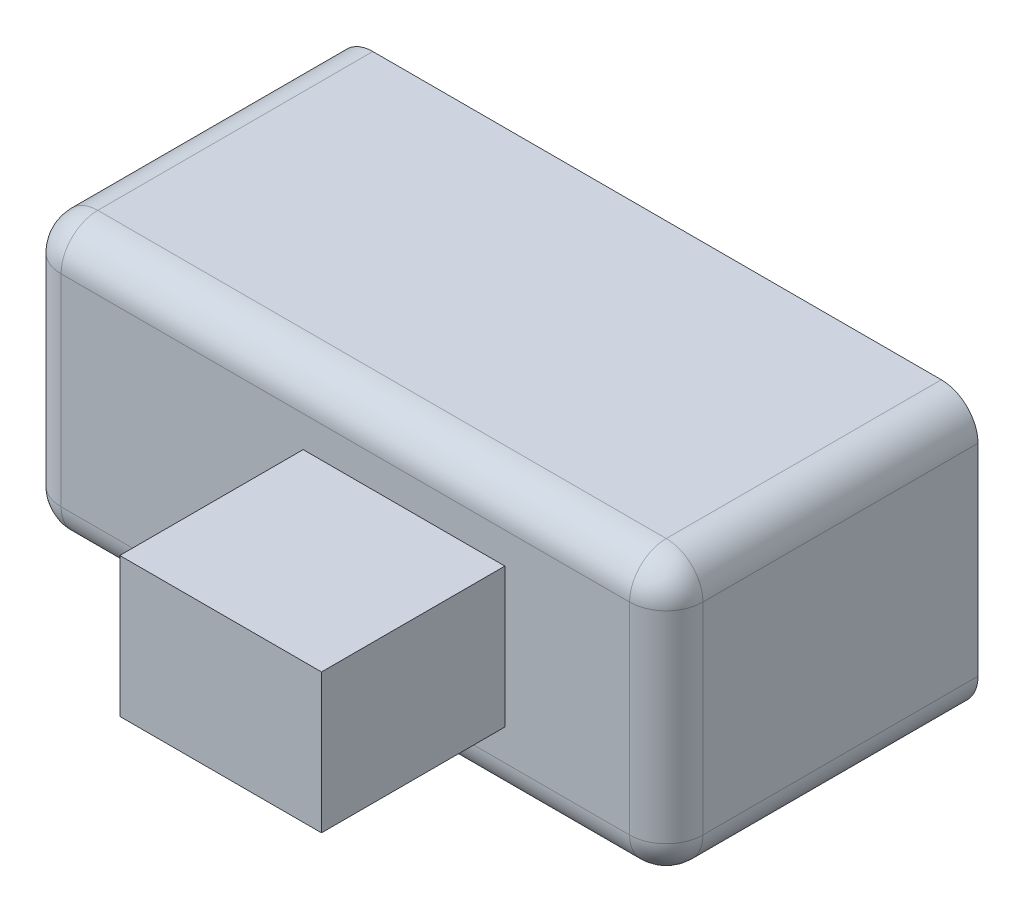
ISO-10303-21;
HEADER;
FILE_DESCRIPTION(('STEP AP214'),'2;1');
FILE_NAME('part.step','',(''),(''),'','','');
FILE_SCHEMA(('AUTOMOTIVE_DESIGN { 1 0 10303 214 1 1 1 1 }'));
ENDSEC;
DATA;
#1=APPLICATION_CONTEXT('core data for automotive mechanical design processes');
#2=APPLICATION_PROTOCOL_DEFINITION('international standard','automotive_design',2000,#1);
#3=PRODUCT_CONTEXT('',#1,'mechanical');
#4=PRODUCT('Part','Part','',(#3));
#5=PRODUCT_RELATED_PRODUCT_CATEGORY('part','',(#4));
#6=PRODUCT_DEFINITION_FORMATION('','',#4);
#7=PRODUCT_DEFINITION_CONTEXT('part definition',#1,'design');
#8=PRODUCT_DEFINITION('design','',#6,#7);
#9=PRODUCT_DEFINITION_SHAPE('','',#8);
#10=(LENGTH_UNIT() NAMED_UNIT(*) SI_UNIT(.MILLI.,.METRE.));
#11=(NAMED_UNIT(*) PLANE_ANGLE_UNIT() SI_UNIT($,.RADIAN.));
#12=(NAMED_UNIT(*) SI_UNIT($,.STERADIAN.) SOLID_ANGLE_UNIT());
#13=UNCERTAINTY_MEASURE_WITH_UNIT(LENGTH_MEASURE(1.E-05),#10,'distance_accuracy_value','');
#14=(GEOMETRIC_REPRESENTATION_CONTEXT(3) GLOBAL_UNCERTAINTY_ASSIGNED_CONTEXT((#13)) GLOBAL_UNIT_ASSIGNED_CONTEXT((#10,
#11,#12)) REPRESENTATION_CONTEXT('',''));
#15=CARTESIAN_POINT('',(0.,0.,0.));
#16=DIRECTION('',(0.,0.,1.));
#17=DIRECTION('',(1.,0.,0.));
#18=AXIS2_PLACEMENT_3D('',#15,#16,#17);
#19=CARTESIAN_POINT('',(0.,0.,8.5));
#20=DIRECTION('',(0.,0.,1.));
#21=DIRECTION('',(1.,0.,0.));
#22=AXIS2_PLACEMENT_3D('',#19,#20,#21);
#23=PLANE('',#22);
#24=DIRECTION('',(0.,-1.,0.));
#25=VECTOR('',#24,1.);
#26=CARTESIAN_POINT('',(-7.75,-2.75,8.5));
#27=LINE('',#26,#25);
#28=CARTESIAN_POINT('',(-7.75,2.75,8.5));
#29=VERTEX_POINT('',#28);
#30=CARTESIAN_POINT('',(-7.75,-2.75,8.5));
#31=VERTEX_POINT('',#30);
#32=EDGE_CURVE('E229',#29,#31,#27,.T.);
#33=ORIENTED_EDGE('',*,*,#32,.T.);
#34=DIRECTION('',(1.,0.,0.));
#35=VECTOR('',#34,1.);
#36=CARTESIAN_POINT('',(7.75,-2.75,8.5));
#37=LINE('',#36,#35);
#38=CARTESIAN_POINT('',(7.75,-2.75,8.5));
#39=VERTEX_POINT('',#38);
#40=EDGE_CURVE('E231',#31,#39,#37,.T.);
#41=ORIENTED_EDGE('',*,*,#40,.T.);
#42=DIRECTION('',(0.,1.,0.));
#43=VECTOR('',#42,1.);
#44=CARTESIAN_POINT('',(7.75,2.75,8.5));
#45=LINE('',#44,#43);
#46=CARTESIAN_POINT('',(7.75,2.75,8.5));
#47=VERTEX_POINT('',#46);
#48=EDGE_CURVE('E225',#39,#47,#45,.T.);
#49=ORIENTED_EDGE('',*,*,#48,.T.);
#50=DIRECTION('',(-1.,0.,0.));
#51=VECTOR('',#50,1.);
#52=CARTESIAN_POINT('',(-7.75,2.75,8.5));
#53=LINE('',#52,#51);
#54=EDGE_CURVE('E227',#47,#29,#53,.T.);
#55=ORIENTED_EDGE('',*,*,#54,.T.);
#56=EDGE_LOOP('',(#33,#41,#49,#55));
#57=FACE_BOUND('',#56,.T.);
#58=DIRECTION('',(-1.,0.,0.));
#59=VECTOR('',#58,1.);
#60=CARTESIAN_POINT('',(-1.15,1.9,8.5));
#61=LINE('',#60,#59);
#62=CARTESIAN_POINT('',(4.35,1.9,8.5));
#63=VERTEX_POINT('',#62);
#64=CARTESIAN_POINT('',(-1.15,1.9,8.5));
#65=VERTEX_POINT('',#64);
#66=EDGE_CURVE('E269',#63,#65,#61,.T.);
#67=ORIENTED_EDGE('',*,*,#66,.F.);
#68=DIRECTION('',(0.,1.,0.));
#69=VECTOR('',#68,1.);
#70=CARTESIAN_POINT('',(4.35,1.9,8.5));
#71=LINE('',#70,#69);
#72=CARTESIAN_POINT('',(4.35,-1.9,8.5));
#73=VERTEX_POINT('',#72);
#74=EDGE_CURVE('E177',#73,#63,#71,.T.);
#75=ORIENTED_EDGE('',*,*,#74,.F.);
#76=DIRECTION('',(1.,0.,0.));
#77=VECTOR('',#76,1.);
#78=CARTESIAN_POINT('',(-1.15,-1.9,8.5));
#79=LINE('',#78,#77);
#80=CARTESIAN_POINT('',(-1.15,-1.9,8.5));
#81=VERTEX_POINT('',#80);
#82=EDGE_CURVE('E173',#81,#73,#79,.T.);
#83=ORIENTED_EDGE('',*,*,#82,.F.);
#84=DIRECTION('',(0.,-1.,0.));
#85=VECTOR('',#84,1.);
#86=CARTESIAN_POINT('',(-1.15,1.9,8.5));
#87=LINE('',#86,#85);
#88=EDGE_CURVE('E271',#65,#81,#87,.T.);
#89=ORIENTED_EDGE('',*,*,#88,.F.);
#90=EDGE_LOOP('',(#67,#75,#83,#89));
#91=FACE_BOUND('',#90,.T.);
#92=ADVANCED_FACE('F51',(#57,#91),#23,.T.);
#93=CARTESIAN_POINT('',(8.75,3.75,8.5));
#94=DIRECTION('',(-1.,0.,0.));
#95=DIRECTION('',(0.,0.,1.));
#96=AXIS2_PLACEMENT_3D('',#93,#94,#95);
#97=PLANE('',#96);
#98=DIRECTION('',(0.,0.,-1.));
#99=VECTOR('',#98,1.);
#100=CARTESIAN_POINT('',(8.75,2.75,8.5));
#101=LINE('',#100,#99);
#102=CARTESIAN_POINT('',(8.75,2.75,0.));
#103=VERTEX_POINT('',#102);
#104=CARTESIAN_POINT('',(8.75,2.75,7.5));
#105=VERTEX_POINT('',#104);
#106=EDGE_CURVE('E196',#103,#105,#101,.F.);
#107=ORIENTED_EDGE('',*,*,#106,.T.);
#108=DIRECTION('',(0.,1.,0.));
#109=VECTOR('',#108,1.);
#110=CARTESIAN_POINT('',(8.75,-2.75,7.5));
#111=LINE('',#110,#109);
#112=CARTESIAN_POINT('',(8.75,-2.75,7.5));
#113=VERTEX_POINT('',#112);
#114=EDGE_CURVE('E12',#105,#113,#111,.F.);
#115=ORIENTED_EDGE('',*,*,#114,.T.);
#116=DIRECTION('',(0.,0.,-1.));
#117=VECTOR('',#116,1.);
#118=CARTESIAN_POINT('',(8.75,-2.75,8.5));
#119=LINE('',#118,#117);
#120=CARTESIAN_POINT('',(8.75,-2.75,0.));
#121=VERTEX_POINT('',#120);
#122=EDGE_CURVE('E198',#113,#121,#119,.T.);
#123=ORIENTED_EDGE('',*,*,#122,.T.);
#124=DIRECTION('',(0.,1.,0.));
#125=VECTOR('',#124,1.);
#126=CARTESIAN_POINT('',(8.75,3.75,0.));
#127=LINE('',#126,#125);
#128=EDGE_CURVE('E179',#121,#103,#127,.T.);
#129=ORIENTED_EDGE('',*,*,#128,.T.);
#130=EDGE_LOOP('',(#107,#115,#123,#129));
#131=FACE_BOUND('',#130,.T.);
#132=ADVANCED_FACE('F289',(#131),#97,.F.);
#133=CARTESIAN_POINT('',(-8.75,3.75,8.5));
#134=DIRECTION('',(0.,-1.,0.));
#135=DIRECTION('',(0.,0.,-1.));
#136=AXIS2_PLACEMENT_3D('',#133,#134,#135);
#137=PLANE('',#136);
#138=DIRECTION('',(0.,0.,-1.));
#139=VECTOR('',#138,1.);
#140=CARTESIAN_POINT('',(-7.75,3.75,8.5));
#141=LINE('',#140,#139);
#142=CARTESIAN_POINT('',(-7.75,3.75,0.));
#143=VERTEX_POINT('',#142);
#144=CARTESIAN_POINT('',(-7.75,3.75,7.5));
#145=VERTEX_POINT('',#144);
#146=EDGE_CURVE('E213',#143,#145,#141,.F.);
#147=ORIENTED_EDGE('',*,*,#146,.T.);
#148=DIRECTION('',(-1.,0.,0.));
#149=VECTOR('',#148,1.);
#150=CARTESIAN_POINT('',(7.75,3.75,7.5));
#151=LINE('',#150,#149);
#152=CARTESIAN_POINT('',(7.75,3.75,7.5));
#153=VERTEX_POINT('',#152);
#154=EDGE_CURVE('E75',#145,#153,#151,.F.);
#155=ORIENTED_EDGE('',*,*,#154,.T.);
#156=DIRECTION('',(0.,0.,-1.));
#157=VECTOR('',#156,1.);
#158=CARTESIAN_POINT('',(7.75,3.75,8.5));
#159=LINE('',#158,#157);
#160=CARTESIAN_POINT('',(7.75,3.75,0.));
#161=VERTEX_POINT('',#160);
#162=EDGE_CURVE('E215',#153,#161,#159,.T.);
#163=ORIENTED_EDGE('',*,*,#162,.T.);
#164=DIRECTION('',(-1.,0.,0.));
#165=VECTOR('',#164,1.);
#166=CARTESIAN_POINT('',(-8.75,3.75,0.));
#167=LINE('',#166,#165);
#168=EDGE_CURVE('E182',#161,#143,#167,.T.);
#169=ORIENTED_EDGE('',*,*,#168,.T.);
#170=EDGE_LOOP('',(#147,#155,#163,#169));
#171=FACE_BOUND('',#170,.T.);
#172=ADVANCED_FACE('F295',(#171),#137,.F.);
#173=CARTESIAN_POINT('',(-8.75,3.75,8.5));
#174=DIRECTION('',(1.,0.,0.));
#175=DIRECTION('',(0.,0.,-1.));
#176=AXIS2_PLACEMENT_3D('',#173,#174,#175);
#177=PLANE('',#176);
#178=DIRECTION('',(0.,0.,-1.));
#179=VECTOR('',#178,1.);
#180=CARTESIAN_POINT('',(-8.75,-2.75,8.5));
#181=LINE('',#180,#179);
#182=CARTESIAN_POINT('',(-8.75,-2.75,0.));
#183=VERTEX_POINT('',#182);
#184=CARTESIAN_POINT('',(-8.75,-2.75,7.5));
#185=VERTEX_POINT('',#184);
#186=EDGE_CURVE('E219',#183,#185,#181,.F.);
#187=ORIENTED_EDGE('',*,*,#186,.T.);
#188=DIRECTION('',(0.,-1.,0.));
#189=VECTOR('',#188,1.);
#190=CARTESIAN_POINT('',(-8.75,2.75,7.5));
#191=LINE('',#190,#189);
#192=CARTESIAN_POINT('',(-8.75,2.75,7.5));
#193=VERTEX_POINT('',#192);
#194=EDGE_CURVE('E238',#185,#193,#191,.F.);
#195=ORIENTED_EDGE('',*,*,#194,.T.);
#196=DIRECTION('',(0.,0.,-1.));
#197=VECTOR('',#196,1.);
#198=CARTESIAN_POINT('',(-8.75,2.75,8.5));
#199=LINE('',#198,#197);
#200=CARTESIAN_POINT('',(-8.75,2.75,0.));
#201=VERTEX_POINT('',#200);
#202=EDGE_CURVE('E217',#193,#201,#199,.T.);
#203=ORIENTED_EDGE('',*,*,#202,.T.);
#204=DIRECTION('',(0.,-1.,0.));
#205=VECTOR('',#204,1.);
#206=CARTESIAN_POINT('',(-8.75,3.75,0.));
#207=LINE('',#206,#205);
#208=EDGE_CURVE('E190',#201,#183,#207,.T.);
#209=ORIENTED_EDGE('',*,*,#208,.T.);
#210=EDGE_LOOP('',(#187,#195,#203,#209));
#211=FACE_BOUND('',#210,.T.);
#212=ADVANCED_FACE('F308',(#211),#177,.F.);
#213=CARTESIAN_POINT('',(-8.75,-3.75,8.5));
#214=DIRECTION('',(0.,1.,0.));
#215=DIRECTION('',(0.,0.,1.));
#216=AXIS2_PLACEMENT_3D('',#213,#214,#215);
#217=PLANE('',#216);
#218=DIRECTION('',(0.,0.,-1.));
#219=VECTOR('',#218,1.);
#220=CARTESIAN_POINT('',(7.75,-3.75,8.5));
#221=LINE('',#220,#219);
#222=CARTESIAN_POINT('',(7.75,-3.75,0.));
#223=VERTEX_POINT('',#222);
#224=CARTESIAN_POINT('',(7.75,-3.75,7.5));
#225=VERTEX_POINT('',#224);
#226=EDGE_CURVE('E210',#223,#225,#221,.F.);
#227=ORIENTED_EDGE('',*,*,#226,.T.);
#228=DIRECTION('',(1.,0.,0.));
#229=VECTOR('',#228,1.);
#230=CARTESIAN_POINT('',(-7.75,-3.75,7.5));
#231=LINE('',#230,#229);
#232=CARTESIAN_POINT('',(-7.75,-3.75,7.5));
#233=VERTEX_POINT('',#232);
#234=EDGE_CURVE('E234',#225,#233,#231,.F.);
#235=ORIENTED_EDGE('',*,*,#234,.T.);
#236=DIRECTION('',(0.,0.,-1.));
#237=VECTOR('',#236,1.);
#238=CARTESIAN_POINT('',(-7.75,-3.75,8.5));
#239=LINE('',#238,#237);
#240=CARTESIAN_POINT('',(-7.75,-3.75,0.));
#241=VERTEX_POINT('',#240);
#242=EDGE_CURVE('E208',#233,#241,#239,.T.);
#243=ORIENTED_EDGE('',*,*,#242,.T.);
#244=DIRECTION('',(1.,0.,0.));
#245=VECTOR('',#244,1.);
#246=CARTESIAN_POINT('',(-8.75,-3.75,0.));
#247=LINE('',#246,#245);
#248=EDGE_CURVE('E193',#241,#223,#247,.T.);
#249=ORIENTED_EDGE('',*,*,#248,.T.);
#250=EDGE_LOOP('',(#227,#235,#243,#249));
#251=FACE_BOUND('',#250,.T.);
#252=ADVANCED_FACE('F304',(#251),#217,.F.);
#253=CARTESIAN_POINT('',(0.,0.,0.));
#254=DIRECTION('',(0.,0.,1.));
#255=DIRECTION('',(1.,0.,0.));
#256=AXIS2_PLACEMENT_3D('',#253,#254,#255);
#257=PLANE('',#256);
#258=ORIENTED_EDGE('',*,*,#128,.F.);
#259=CARTESIAN_POINT('',(7.75,-2.75,0.));
#260=DIRECTION('',(0.,0.,1.));
#261=DIRECTION('',(1.,0.,0.));
#262=AXIS2_PLACEMENT_3D('',#259,#260,#261);
#263=CIRCLE('',#262,1.);
#264=EDGE_CURVE('E206',#121,#223,#263,.F.);
#265=ORIENTED_EDGE('',*,*,#264,.T.);
#266=ORIENTED_EDGE('',*,*,#248,.F.);
#267=CARTESIAN_POINT('',(-7.75,-2.75,0.));
#268=DIRECTION('',(0.,0.,1.));
#269=DIRECTION('',(1.,0.,0.));
#270=AXIS2_PLACEMENT_3D('',#267,#268,#269);
#271=CIRCLE('',#270,1.);
#272=EDGE_CURVE('E202',#241,#183,#271,.F.);
#273=ORIENTED_EDGE('',*,*,#272,.T.);
#274=ORIENTED_EDGE('',*,*,#208,.F.);
#275=CARTESIAN_POINT('',(-7.75,2.75,0.));
#276=DIRECTION('',(0.,0.,1.));
#277=DIRECTION('',(1.,0.,0.));
#278=AXIS2_PLACEMENT_3D('',#275,#276,#277);
#279=CIRCLE('',#278,1.);
#280=EDGE_CURVE('E200',#201,#143,#279,.F.);
#281=ORIENTED_EDGE('',*,*,#280,.T.);
#282=ORIENTED_EDGE('',*,*,#168,.F.);
#283=CARTESIAN_POINT('',(7.75,2.75,0.));
#284=DIRECTION('',(0.,0.,1.));
#285=DIRECTION('',(1.,0.,0.));
#286=AXIS2_PLACEMENT_3D('',#283,#284,#285);
#287=CIRCLE('',#286,1.);
#288=EDGE_CURVE('E204',#161,#103,#287,.F.);
#289=ORIENTED_EDGE('',*,*,#288,.T.);
#290=EDGE_LOOP('',(#258,#265,#266,#273,#274,#281,#282,#289));
#291=FACE_BOUND('',#290,.T.);
#292=ADVANCED_FACE('F301',(#291),#257,.F.);
#293=CARTESIAN_POINT('',(4.35,1.9,13.5));
#294=DIRECTION('',(-1.,0.,0.));
#295=DIRECTION('',(0.,-1.,0.));
#296=AXIS2_PLACEMENT_3D('',#293,#294,#295);
#297=PLANE('',#296);
#298=ORIENTED_EDGE('',*,*,#74,.T.);
#299=DIRECTION('',(0.,0.,-1.));
#300=VECTOR('',#299,1.);
#301=CARTESIAN_POINT('',(4.35,1.9,13.5));
#302=LINE('',#301,#300);
#303=CARTESIAN_POINT('',(4.35,1.9,13.5));
#304=VERTEX_POINT('',#303);
#305=EDGE_CURVE('E157',#304,#63,#302,.T.);
#306=ORIENTED_EDGE('',*,*,#305,.F.);
#307=DIRECTION('',(0.,1.,0.));
#308=VECTOR('',#307,1.);
#309=CARTESIAN_POINT('',(4.35,1.9,13.5));
#310=LINE('',#309,#308);
#311=CARTESIAN_POINT('',(4.35,-1.9,13.5));
#312=VERTEX_POINT('',#311);
#313=EDGE_CURVE('E164',#312,#304,#310,.T.);
#314=ORIENTED_EDGE('',*,*,#313,.F.);
#315=DIRECTION('',(0.,0.,-1.));
#316=VECTOR('',#315,1.);
#317=CARTESIAN_POINT('',(4.35,-1.9,13.5));
#318=LINE('',#317,#316);
#319=EDGE_CURVE('E279',#312,#73,#318,.T.);
#320=ORIENTED_EDGE('',*,*,#319,.T.);
#321=EDGE_LOOP('',(#298,#306,#314,#320));
#322=FACE_BOUND('',#321,.T.);
#323=ADVANCED_FACE('F175',(#322),#297,.F.);
#324=CARTESIAN_POINT('',(-1.15,1.9,13.5));
#325=DIRECTION('',(0.,-1.,0.));
#326=DIRECTION('',(0.,0.,-1.));
#327=AXIS2_PLACEMENT_3D('',#324,#325,#326);
#328=PLANE('',#327);
#329=ORIENTED_EDGE('',*,*,#66,.T.);
#330=DIRECTION('',(0.,0.,-1.));
#331=VECTOR('',#330,1.);
#332=CARTESIAN_POINT('',(-1.15,1.9,13.5));
#333=LINE('',#332,#331);
#334=CARTESIAN_POINT('',(-1.15,1.9,13.5));
#335=VERTEX_POINT('',#334);
#336=EDGE_CURVE('E160',#335,#65,#333,.T.);
#337=ORIENTED_EDGE('',*,*,#336,.F.);
#338=DIRECTION('',(-1.,0.,0.));
#339=VECTOR('',#338,1.);
#340=CARTESIAN_POINT('',(-1.15,1.9,13.5));
#341=LINE('',#340,#339);
#342=EDGE_CURVE('E153',#304,#335,#341,.T.);
#343=ORIENTED_EDGE('',*,*,#342,.F.);
#344=ORIENTED_EDGE('',*,*,#305,.T.);
#345=EDGE_LOOP('',(#329,#337,#343,#344));
#346=FACE_BOUND('',#345,.T.);
#347=ADVANCED_FACE('F155',(#346),#328,.F.);
#348=CARTESIAN_POINT('',(-1.15,1.9,13.5));
#349=DIRECTION('',(1.,0.,0.));
#350=DIRECTION('',(0.,1.,0.));
#351=AXIS2_PLACEMENT_3D('',#348,#349,#350);
#352=PLANE('',#351);
#353=ORIENTED_EDGE('',*,*,#88,.T.);
#354=DIRECTION('',(0.,0.,-1.));
#355=VECTOR('',#354,1.);
#356=CARTESIAN_POINT('',(-1.15,-1.9,13.5));
#357=LINE('',#356,#355);
#358=CARTESIAN_POINT('',(-1.15,-1.9,13.5));
#359=VERTEX_POINT('',#358);
#360=EDGE_CURVE('E184',#359,#81,#357,.T.);
#361=ORIENTED_EDGE('',*,*,#360,.F.);
#362=DIRECTION('',(0.,-1.,0.));
#363=VECTOR('',#362,1.);
#364=CARTESIAN_POINT('',(-1.15,1.9,13.5));
#365=LINE('',#364,#363);
#366=EDGE_CURVE('E163',#335,#359,#365,.T.);
#367=ORIENTED_EDGE('',*,*,#366,.F.);
#368=ORIENTED_EDGE('',*,*,#336,.T.);
#369=EDGE_LOOP('',(#353,#361,#367,#368));
#370=FACE_BOUND('',#369,.T.);
#371=ADVANCED_FACE('F286',(#370),#352,.F.);
#372=CARTESIAN_POINT('',(-1.15,-1.9,13.5));
#373=DIRECTION('',(0.,1.,0.));
#374=DIRECTION('',(0.,0.,1.));
#375=AXIS2_PLACEMENT_3D('',#372,#373,#374);
#376=PLANE('',#375);
#377=ORIENTED_EDGE('',*,*,#82,.T.);
#378=ORIENTED_EDGE('',*,*,#319,.F.);
#379=DIRECTION('',(1.,0.,0.));
#380=VECTOR('',#379,1.);
#381=CARTESIAN_POINT('',(-1.15,-1.9,13.5));
#382=LINE('',#381,#380);
#383=EDGE_CURVE('E169',#359,#312,#382,.T.);
#384=ORIENTED_EDGE('',*,*,#383,.F.);
#385=ORIENTED_EDGE('',*,*,#360,.T.);
#386=EDGE_LOOP('',(#377,#378,#384,#385));
#387=FACE_BOUND('',#386,.T.);
#388=ADVANCED_FACE('F282',(#387),#376,.F.);
#389=CARTESIAN_POINT('',(0.,0.,13.5));
#390=DIRECTION('',(0.,0.,1.));
#391=DIRECTION('',(1.,0.,0.));
#392=AXIS2_PLACEMENT_3D('',#389,#390,#391);
#393=PLANE('',#392);
#394=ORIENTED_EDGE('',*,*,#313,.T.);
#395=ORIENTED_EDGE('',*,*,#342,.T.);
#396=ORIENTED_EDGE('',*,*,#366,.T.);
#397=ORIENTED_EDGE('',*,*,#383,.T.);
#398=EDGE_LOOP('',(#394,#395,#396,#397));
#399=FACE_BOUND('',#398,.T.);
#400=ADVANCED_FACE('F167',(#399),#393,.T.);
#401=CARTESIAN_POINT('',(7.75,-2.75,8.5));
#402=DIRECTION('',(0.,0.,-1.));
#403=DIRECTION('',(-1.,0.,0.));
#404=AXIS2_PLACEMENT_3D('',#401,#402,#403);
#405=CYLINDRICAL_SURFACE('',#404,1.);
#406=ORIENTED_EDGE('',*,*,#122,.F.);
#407=CARTESIAN_POINT('',(7.75,-2.75,7.5));
#408=DIRECTION('',(0.,0.,-1.));
#409=DIRECTION('',(-1.,0.,0.));
#410=AXIS2_PLACEMENT_3D('',#407,#408,#409);
#411=CIRCLE('',#410,1.);
#412=EDGE_CURVE('E222',#113,#225,#411,.T.);
#413=ORIENTED_EDGE('',*,*,#412,.T.);
#414=ORIENTED_EDGE('',*,*,#226,.F.);
#415=ORIENTED_EDGE('',*,*,#264,.F.);
#416=EDGE_LOOP('',(#406,#413,#414,#415));
#417=FACE_BOUND('',#416,.T.);
#418=ADVANCED_FACE('F315',(#417),#405,.T.);
#419=CARTESIAN_POINT('',(7.75,2.75,8.5));
#420=DIRECTION('',(0.,0.,-1.));
#421=DIRECTION('',(-1.,0.,0.));
#422=AXIS2_PLACEMENT_3D('',#419,#420,#421);
#423=CYLINDRICAL_SURFACE('',#422,1.);
#424=ORIENTED_EDGE('',*,*,#162,.F.);
#425=CARTESIAN_POINT('',(7.75,2.75,7.5));
#426=DIRECTION('',(0.,0.,-1.));
#427=DIRECTION('',(-1.,0.,0.));
#428=AXIS2_PLACEMENT_3D('',#425,#426,#427);
#429=CIRCLE('',#428,1.);
#430=EDGE_CURVE('E60',#153,#105,#429,.T.);
#431=ORIENTED_EDGE('',*,*,#430,.T.);
#432=ORIENTED_EDGE('',*,*,#106,.F.);
#433=ORIENTED_EDGE('',*,*,#288,.F.);
#434=EDGE_LOOP('',(#424,#431,#432,#433));
#435=FACE_BOUND('',#434,.T.);
#436=ADVANCED_FACE('F318',(#435),#423,.T.);
#437=CARTESIAN_POINT('',(-7.75,-2.75,8.5));
#438=DIRECTION('',(0.,0.,-1.));
#439=DIRECTION('',(-1.,0.,0.));
#440=AXIS2_PLACEMENT_3D('',#437,#438,#439);
#441=CYLINDRICAL_SURFACE('',#440,1.);
#442=ORIENTED_EDGE('',*,*,#242,.F.);
#443=CARTESIAN_POINT('',(-7.75,-2.75,7.5));
#444=DIRECTION('',(0.,0.,-1.));
#445=DIRECTION('',(-1.,0.,0.));
#446=AXIS2_PLACEMENT_3D('',#443,#444,#445);
#447=CIRCLE('',#446,1.);
#448=EDGE_CURVE('E236',#233,#185,#447,.T.);
#449=ORIENTED_EDGE('',*,*,#448,.T.);
#450=ORIENTED_EDGE('',*,*,#186,.F.);
#451=ORIENTED_EDGE('',*,*,#272,.F.);
#452=EDGE_LOOP('',(#442,#449,#450,#451));
#453=FACE_BOUND('',#452,.T.);
#454=ADVANCED_FACE('F322',(#453),#441,.T.);
#455=CARTESIAN_POINT('',(-7.75,2.75,8.5));
#456=DIRECTION('',(0.,0.,-1.));
#457=DIRECTION('',(-1.,0.,0.));
#458=AXIS2_PLACEMENT_3D('',#455,#456,#457);
#459=CYLINDRICAL_SURFACE('',#458,1.);
#460=ORIENTED_EDGE('',*,*,#202,.F.);
#461=CARTESIAN_POINT('',(-7.75,2.75,7.5));
#462=DIRECTION('',(0.,0.,-1.));
#463=DIRECTION('',(-1.,0.,0.));
#464=AXIS2_PLACEMENT_3D('',#461,#462,#463);
#465=CIRCLE('',#464,1.);
#466=EDGE_CURVE('E240',#193,#145,#465,.T.);
#467=ORIENTED_EDGE('',*,*,#466,.T.);
#468=ORIENTED_EDGE('',*,*,#146,.F.);
#469=ORIENTED_EDGE('',*,*,#280,.F.);
#470=EDGE_LOOP('',(#460,#467,#468,#469));
#471=FACE_BOUND('',#470,.T.);
#472=ADVANCED_FACE('F325',(#471),#459,.T.);
#473=CARTESIAN_POINT('',(-7.75,2.75,7.5));
#474=DIRECTION('',(0.,0.,1.));
#475=DIRECTION('',(1.,0.,0.));
#476=AXIS2_PLACEMENT_3D('',#473,#474,#475);
#477=SPHERICAL_SURFACE('',#476,1.);
#478=CARTESIAN_POINT('',(-7.75,2.75,7.5));
#479=DIRECTION('',(1.,0.,0.));
#480=DIRECTION('',(0.,0.,-1.));
#481=AXIS2_PLACEMENT_3D('',#478,#479,#480);
#482=CIRCLE('',#481,1.);
#483=EDGE_CURVE('E259',#145,#29,#482,.T.);
#484=ORIENTED_EDGE('',*,*,#483,.F.);
#485=ORIENTED_EDGE('',*,*,#466,.F.);
#486=CARTESIAN_POINT('',(-7.75,2.75,7.5));
#487=DIRECTION('',(0.,-1.,0.));
#488=DIRECTION('',(0.,0.,-1.));
#489=AXIS2_PLACEMENT_3D('',#486,#487,#488);
#490=CIRCLE('',#489,1.);
#491=EDGE_CURVE('E55',#29,#193,#490,.T.);
#492=ORIENTED_EDGE('',*,*,#491,.F.);
#493=EDGE_LOOP('',(#484,#485,#492));
#494=FACE_BOUND('',#493,.T.);
#495=ADVANCED_FACE('F53',(#494),#477,.T.);
#496=CARTESIAN_POINT('',(-7.75,0.,7.5));
#497=DIRECTION('',(0.,1.,0.));
#498=DIRECTION('',(0.,0.,1.));
#499=AXIS2_PLACEMENT_3D('',#496,#497,#498);
#500=CYLINDRICAL_SURFACE('',#499,1.);
#501=ORIENTED_EDGE('',*,*,#491,.T.);
#502=ORIENTED_EDGE('',*,*,#194,.F.);
#503=CARTESIAN_POINT('',(-7.75,-2.75,7.5));
#504=DIRECTION('',(0.,-1.,0.));
#505=DIRECTION('',(0.,0.,-1.));
#506=AXIS2_PLACEMENT_3D('',#503,#504,#505);
#507=CIRCLE('',#506,1.);
#508=EDGE_CURVE('E257',#31,#185,#507,.T.);
#509=ORIENTED_EDGE('',*,*,#508,.F.);
#510=ORIENTED_EDGE('',*,*,#32,.F.);
#511=EDGE_LOOP('',(#501,#502,#509,#510));
#512=FACE_BOUND('',#511,.T.);
#513=ADVANCED_FACE('F352',(#512),#500,.T.);
#514=CARTESIAN_POINT('',(0.,2.75,7.5));
#515=DIRECTION('',(1.,0.,0.));
#516=DIRECTION('',(0.,0.,-1.));
#517=AXIS2_PLACEMENT_3D('',#514,#515,#516);
#518=CYLINDRICAL_SURFACE('',#517,1.);
#519=ORIENTED_EDGE('',*,*,#483,.T.);
#520=ORIENTED_EDGE('',*,*,#54,.F.);
#521=CARTESIAN_POINT('',(7.75,2.75,7.5));
#522=DIRECTION('',(1.,0.,0.));
#523=DIRECTION('',(0.,0.,-1.));
#524=AXIS2_PLACEMENT_3D('',#521,#522,#523);
#525=CIRCLE('',#524,1.);
#526=EDGE_CURVE('E254',#153,#47,#525,.T.);
#527=ORIENTED_EDGE('',*,*,#526,.F.);
#528=ORIENTED_EDGE('',*,*,#154,.F.);
#529=EDGE_LOOP('',(#519,#520,#527,#528));
#530=FACE_BOUND('',#529,.T.);
#531=ADVANCED_FACE('F349',(#530),#518,.T.);
#532=CARTESIAN_POINT('',(-7.75,-2.75,7.5));
#533=DIRECTION('',(0.,0.,1.));
#534=DIRECTION('',(1.,0.,0.));
#535=AXIS2_PLACEMENT_3D('',#532,#533,#534);
#536=SPHERICAL_SURFACE('',#535,1.);
#537=ORIENTED_EDGE('',*,*,#508,.T.);
#538=ORIENTED_EDGE('',*,*,#448,.F.);
#539=CARTESIAN_POINT('',(-7.75,-2.75,7.5));
#540=DIRECTION('',(1.,0.,0.));
#541=DIRECTION('',(0.,0.,-1.));
#542=AXIS2_PLACEMENT_3D('',#539,#540,#541);
#543=CIRCLE('',#542,1.);
#544=EDGE_CURVE('E251',#31,#233,#543,.T.);
#545=ORIENTED_EDGE('',*,*,#544,.F.);
#546=EDGE_LOOP('',(#537,#538,#545));
#547=FACE_BOUND('',#546,.T.);
#548=ADVANCED_FACE('F345',(#547),#536,.T.);
#549=CARTESIAN_POINT('',(7.75,2.75,7.5));
#550=DIRECTION('',(0.,0.,1.));
#551=DIRECTION('',(1.,0.,0.));
#552=AXIS2_PLACEMENT_3D('',#549,#550,#551);
#553=SPHERICAL_SURFACE('',#552,1.);
#554=ORIENTED_EDGE('',*,*,#430,.F.);
#555=ORIENTED_EDGE('',*,*,#526,.T.);
#556=CARTESIAN_POINT('',(7.75,2.75,7.5));
#557=DIRECTION('',(0.,-1.,0.));
#558=DIRECTION('',(0.,0.,-1.));
#559=AXIS2_PLACEMENT_3D('',#556,#557,#558);
#560=CIRCLE('',#559,1.);
#561=EDGE_CURVE('E248',#105,#47,#560,.T.);
#562=ORIENTED_EDGE('',*,*,#561,.F.);
#563=EDGE_LOOP('',(#554,#555,#562));
#564=FACE_BOUND('',#563,.T.);
#565=ADVANCED_FACE('F341',(#564),#553,.T.);
#566=CARTESIAN_POINT('',(0.,-2.75,7.5));
#567=DIRECTION('',(-1.,0.,0.));
#568=DIRECTION('',(0.,0.,1.));
#569=AXIS2_PLACEMENT_3D('',#566,#567,#568);
#570=CYLINDRICAL_SURFACE('',#569,1.);
#571=ORIENTED_EDGE('',*,*,#544,.T.);
#572=ORIENTED_EDGE('',*,*,#234,.F.);
#573=CARTESIAN_POINT('',(7.75,-2.75,7.5));
#574=DIRECTION('',(1.,0.,0.));
#575=DIRECTION('',(0.,1.,0.));
#576=AXIS2_PLACEMENT_3D('',#573,#574,#575);
#577=CIRCLE('',#576,1.);
#578=EDGE_CURVE('E246',#39,#225,#577,.T.);
#579=ORIENTED_EDGE('',*,*,#578,.F.);
#580=ORIENTED_EDGE('',*,*,#40,.F.);
#581=EDGE_LOOP('',(#571,#572,#579,#580));
#582=FACE_BOUND('',#581,.T.);
#583=ADVANCED_FACE('F337',(#582),#570,.T.);
#584=CARTESIAN_POINT('',(7.75,0.,7.5));
#585=DIRECTION('',(0.,-1.,0.));
#586=DIRECTION('',(0.,0.,-1.));
#587=AXIS2_PLACEMENT_3D('',#584,#585,#586);
#588=CYLINDRICAL_SURFACE('',#587,1.);
#589=ORIENTED_EDGE('',*,*,#561,.T.);
#590=ORIENTED_EDGE('',*,*,#48,.F.);
#591=CARTESIAN_POINT('',(7.75,-2.75,7.5));
#592=DIRECTION('',(0.,-1.,0.));
#593=DIRECTION('',(0.,0.,-1.));
#594=AXIS2_PLACEMENT_3D('',#591,#592,#593);
#595=CIRCLE('',#594,1.);
#596=EDGE_CURVE('E244',#113,#39,#595,.T.);
#597=ORIENTED_EDGE('',*,*,#596,.F.);
#598=ORIENTED_EDGE('',*,*,#114,.F.);
#599=EDGE_LOOP('',(#589,#590,#597,#598));
#600=FACE_BOUND('',#599,.T.);
#601=ADVANCED_FACE('F333',(#600),#588,.T.);
#602=CARTESIAN_POINT('',(7.75,-2.75,7.5));
#603=DIRECTION('',(0.,0.,1.));
#604=DIRECTION('',(1.,0.,0.));
#605=AXIS2_PLACEMENT_3D('',#602,#603,#604);
#606=SPHERICAL_SURFACE('',#605,1.);
#607=ORIENTED_EDGE('',*,*,#578,.T.);
#608=ORIENTED_EDGE('',*,*,#412,.F.);
#609=ORIENTED_EDGE('',*,*,#596,.T.);
#610=EDGE_LOOP('',(#607,#608,#609));
#611=FACE_BOUND('',#610,.T.);
#612=ADVANCED_FACE('F330',(#611),#606,.T.);
#613=CLOSED_SHELL('',(#92,#132,#172,#212,#252,#292,#323,#347,#371,#388,#400,#418,#436,#454,#472,
#495,#513,#531,#548,#565,#583,#601,#612));
#614=MANIFOLD_SOLID_BREP('B2',#613);
#615=ADVANCED_BREP_SHAPE_REPRESENTATION('',(#18,#614),#14);
#616=SHAPE_DEFINITION_REPRESENTATION(#9,#615);
ENDSEC;
END-ISO-10303-21;
